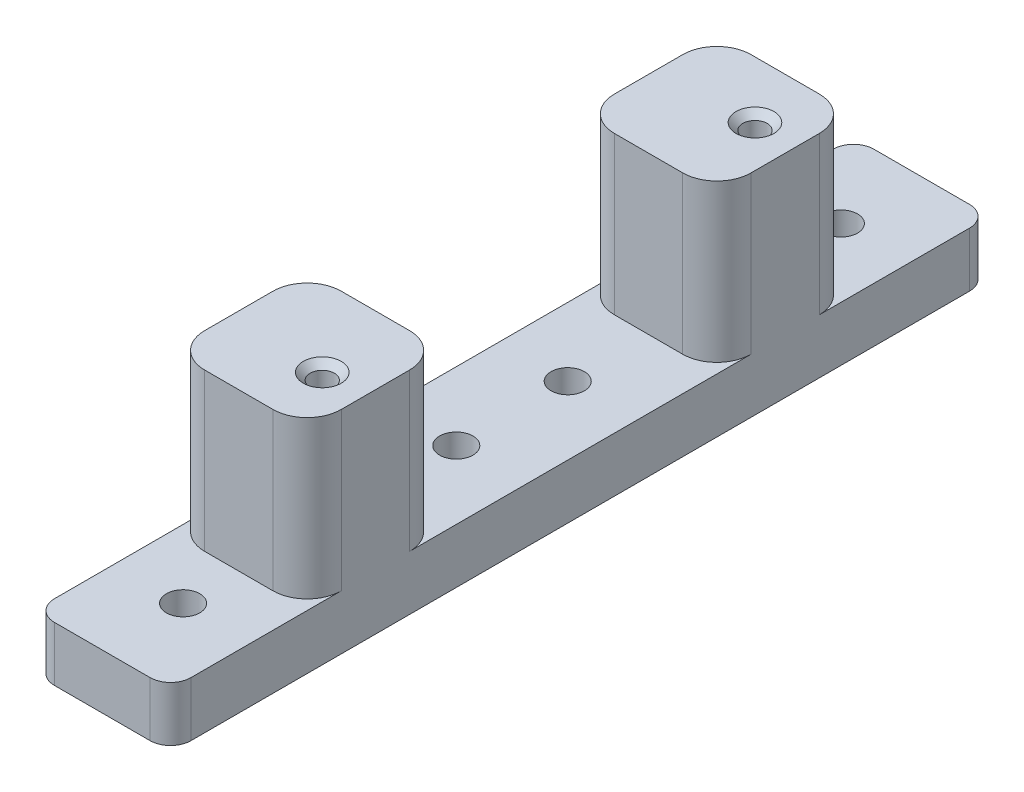
ISO-10303-21;
HEADER;
FILE_DESCRIPTION(('STEP AP214'),'2;1');
FILE_NAME('part.step','',(''),(''),'','','');
FILE_SCHEMA(('AUTOMOTIVE_DESIGN { 1 0 10303 214 1 1 1 1 }'));
ENDSEC;
DATA;
#1=APPLICATION_CONTEXT('core data for automotive mechanical design processes');
#2=APPLICATION_PROTOCOL_DEFINITION('international standard','automotive_design',2000,#1);
#3=PRODUCT_CONTEXT('',#1,'mechanical');
#4=PRODUCT('Part','Part','',(#3));
#5=PRODUCT_RELATED_PRODUCT_CATEGORY('part','',(#4));
#6=PRODUCT_DEFINITION_FORMATION('','',#4);
#7=PRODUCT_DEFINITION_CONTEXT('part definition',#1,'design');
#8=PRODUCT_DEFINITION('design','',#6,#7);
#9=PRODUCT_DEFINITION_SHAPE('','',#8);
#10=(LENGTH_UNIT() NAMED_UNIT(*) SI_UNIT(.MILLI.,.METRE.));
#11=(NAMED_UNIT(*) PLANE_ANGLE_UNIT() SI_UNIT($,.RADIAN.));
#12=(NAMED_UNIT(*) SI_UNIT($,.STERADIAN.) SOLID_ANGLE_UNIT());
#13=UNCERTAINTY_MEASURE_WITH_UNIT(LENGTH_MEASURE(1.E-05),#10,'distance_accuracy_value','');
#14=(GEOMETRIC_REPRESENTATION_CONTEXT(3) GLOBAL_UNCERTAINTY_ASSIGNED_CONTEXT((#13)) GLOBAL_UNIT_ASSIGNED_CONTEXT((#10,
#11,#12)) REPRESENTATION_CONTEXT('',''));
#15=CARTESIAN_POINT('',(0.,0.,0.));
#16=DIRECTION('',(0.,0.,1.));
#17=DIRECTION('',(1.,0.,0.));
#18=AXIS2_PLACEMENT_3D('',#15,#16,#17);
#19=CARTESIAN_POINT('',(0.,4.,0.));
#20=DIRECTION('',(0.,-1.,0.));
#21=DIRECTION('',(0.,0.,-1.));
#22=AXIS2_PLACEMENT_3D('',#19,#20,#21);
#23=PLANE('',#22);
#24=CARTESIAN_POINT('',(0.,4.,-4.08));
#25=DIRECTION('',(0.,1.,0.));
#26=DIRECTION('',(0.,0.,1.));
#27=AXIS2_PLACEMENT_3D('',#24,#25,#26);
#28=CIRCLE('',#27,1.2192);
#29=CARTESIAN_POINT('',(0.,4.,-2.8608));
#30=VERTEX_POINT('',#29);
#31=EDGE_CURVE('E278',#30,#30,#28,.T.);
#32=ORIENTED_EDGE('',*,*,#31,.F.);
#33=EDGE_LOOP('',(#32));
#34=FACE_BOUND('',#33,.T.);
#35=CARTESIAN_POINT('',(0.,4.,4.08));
#36=DIRECTION('',(0.,1.,0.));
#37=DIRECTION('',(0.,0.,1.));
#38=AXIS2_PLACEMENT_3D('',#35,#36,#37);
#39=CIRCLE('',#38,1.2192);
#40=CARTESIAN_POINT('',(0.,4.,5.2992));
#41=VERTEX_POINT('',#40);
#42=EDGE_CURVE('E262',#41,#41,#39,.T.);
#43=ORIENTED_EDGE('',*,*,#42,.F.);
#44=EDGE_LOOP('',(#43));
#45=FACE_BOUND('',#44,.T.);
#46=DIRECTION('',(0.,0.,-1.));
#47=VECTOR('',#46,1.);
#48=CARTESIAN_POINT('',(5.,4.,30.));
#49=LINE('',#48,#47);
#50=CARTESIAN_POINT('',(5.,4.,12.5));
#51=VERTEX_POINT('',#50);
#52=CARTESIAN_POINT('',(5.,4.,-12.5));
#53=VERTEX_POINT('',#52);
#54=EDGE_CURVE('E294',#51,#53,#49,.T.);
#55=ORIENTED_EDGE('',*,*,#54,.T.);
#56=CARTESIAN_POINT('',(2.5,4.,-12.5));
#57=DIRECTION('',(0.,-1.,0.));
#58=DIRECTION('',(0.,0.,-1.));
#59=AXIS2_PLACEMENT_3D('',#56,#57,#58);
#60=CIRCLE('',#59,2.5);
#61=CARTESIAN_POINT('',(2.5,4.,-10.));
#62=VERTEX_POINT('',#61);
#63=EDGE_CURVE('E428',#53,#62,#60,.T.);
#64=ORIENTED_EDGE('',*,*,#63,.T.);
#65=DIRECTION('',(-1.,0.,0.));
#66=VECTOR('',#65,1.);
#67=CARTESIAN_POINT('',(-5.,4.,-9.99999999999999));
#68=LINE('',#67,#66);
#69=CARTESIAN_POINT('',(-2.5,4.,-9.99999999999999));
#70=VERTEX_POINT('',#69);
#71=EDGE_CURVE('E226',#62,#70,#68,.T.);
#72=ORIENTED_EDGE('',*,*,#71,.T.);
#73=CARTESIAN_POINT('',(-2.5,4.,-12.5));
#74=DIRECTION('',(0.,-1.,0.));
#75=DIRECTION('',(0.,0.,-1.));
#76=AXIS2_PLACEMENT_3D('',#73,#74,#75);
#77=CIRCLE('',#76,2.5);
#78=CARTESIAN_POINT('',(-5.,4.,-12.5));
#79=VERTEX_POINT('',#78);
#80=EDGE_CURVE('E425',#70,#79,#77,.T.);
#81=ORIENTED_EDGE('',*,*,#80,.T.);
#82=DIRECTION('',(0.,0.,1.));
#83=VECTOR('',#82,1.);
#84=CARTESIAN_POINT('',(-5.,4.,30.));
#85=LINE('',#84,#83);
#86=CARTESIAN_POINT('',(-5.,4.,12.5));
#87=VERTEX_POINT('',#86);
#88=EDGE_CURVE('E302',#79,#87,#85,.T.);
#89=ORIENTED_EDGE('',*,*,#88,.T.);
#90=CARTESIAN_POINT('',(-2.5,4.,12.5));
#91=DIRECTION('',(0.,-1.,0.));
#92=DIRECTION('',(0.,0.,-1.));
#93=AXIS2_PLACEMENT_3D('',#90,#91,#92);
#94=CIRCLE('',#93,2.5);
#95=CARTESIAN_POINT('',(-2.5,4.,9.99999999999999));
#96=VERTEX_POINT('',#95);
#97=EDGE_CURVE('E382',#87,#96,#94,.T.);
#98=ORIENTED_EDGE('',*,*,#97,.T.);
#99=DIRECTION('',(-1.,0.,0.));
#100=VECTOR('',#99,1.);
#101=CARTESIAN_POINT('',(-5.,4.,9.99999999999999));
#102=LINE('',#101,#100);
#103=CARTESIAN_POINT('',(2.5,4.,10.));
#104=VERTEX_POINT('',#103);
#105=EDGE_CURVE('E253',#104,#96,#102,.T.);
#106=ORIENTED_EDGE('',*,*,#105,.F.);
#107=CARTESIAN_POINT('',(2.5,4.,12.5));
#108=DIRECTION('',(0.,-1.,0.));
#109=DIRECTION('',(0.,0.,-1.));
#110=AXIS2_PLACEMENT_3D('',#107,#108,#109);
#111=CIRCLE('',#110,2.5);
#112=EDGE_CURVE('E384',#104,#51,#111,.T.);
#113=ORIENTED_EDGE('',*,*,#112,.T.);
#114=EDGE_LOOP('',(#55,#64,#72,#81,#89,#98,#106,#113));
#115=FACE_BOUND('',#114,.T.);
#116=ADVANCED_FACE('F47',(#34,#45,#115),#23,.F.);
#117=CARTESIAN_POINT('',(0.,4.,-24.08));
#118=DIRECTION('',(0.,1.,0.));
#119=DIRECTION('',(0.,0.,1.));
#120=AXIS2_PLACEMENT_3D('',#117,#118,#119);
#121=CIRCLE('',#120,1.2192);
#122=CARTESIAN_POINT('',(0.,4.,-22.8608));
#123=VERTEX_POINT('',#122);
#124=EDGE_CURVE('E272',#123,#123,#121,.T.);
#125=ORIENTED_EDGE('',*,*,#124,.F.);
#126=EDGE_LOOP('',(#125));
#127=FACE_BOUND('',#126,.T.);
#128=CARTESIAN_POINT('',(-5.,4.,-28.5));
#129=VERTEX_POINT('',#128);
#130=CARTESIAN_POINT('',(-5.,4.,-17.5));
#131=VERTEX_POINT('',#130);
#132=EDGE_CURVE('E299',#129,#131,#85,.T.);
#133=ORIENTED_EDGE('',*,*,#132,.T.);
#134=CARTESIAN_POINT('',(-2.5,4.,-17.5));
#135=DIRECTION('',(0.,-1.,0.));
#136=DIRECTION('',(0.,0.,-1.));
#137=AXIS2_PLACEMENT_3D('',#134,#135,#136);
#138=CIRCLE('',#137,2.5);
#139=CARTESIAN_POINT('',(-2.5,4.,-20.));
#140=VERTEX_POINT('',#139);
#141=EDGE_CURVE('E71',#131,#140,#138,.T.);
#142=ORIENTED_EDGE('',*,*,#141,.T.);
#143=DIRECTION('',(1.,0.,0.));
#144=VECTOR('',#143,1.);
#145=CARTESIAN_POINT('',(-5.,4.,-20.));
#146=LINE('',#145,#144);
#147=CARTESIAN_POINT('',(2.5,4.,-20.));
#148=VERTEX_POINT('',#147);
#149=EDGE_CURVE('E229',#140,#148,#146,.T.);
#150=ORIENTED_EDGE('',*,*,#149,.T.);
#151=CARTESIAN_POINT('',(2.5,4.,-17.5));
#152=DIRECTION('',(0.,-1.,0.));
#153=DIRECTION('',(0.,0.,-1.));
#154=AXIS2_PLACEMENT_3D('',#151,#152,#153);
#155=CIRCLE('',#154,2.5);
#156=CARTESIAN_POINT('',(5.,4.,-17.5));
#157=VERTEX_POINT('',#156);
#158=EDGE_CURVE('E63',#148,#157,#155,.T.);
#159=ORIENTED_EDGE('',*,*,#158,.T.);
#160=CARTESIAN_POINT('',(5.,4.,-28.5));
#161=VERTEX_POINT('',#160);
#162=EDGE_CURVE('E295',#157,#161,#49,.T.);
#163=ORIENTED_EDGE('',*,*,#162,.T.);
#164=CARTESIAN_POINT('',(3.5,4.,-28.5));
#165=DIRECTION('',(0.,-1.,0.));
#166=DIRECTION('',(0.,0.,-1.));
#167=AXIS2_PLACEMENT_3D('',#164,#165,#166);
#168=CIRCLE('',#167,1.5);
#169=CARTESIAN_POINT('',(3.5,4.,-30.));
#170=VERTEX_POINT('',#169);
#171=EDGE_CURVE('E339',#161,#170,#168,.F.);
#172=ORIENTED_EDGE('',*,*,#171,.T.);
#173=DIRECTION('',(-1.,0.,0.));
#174=VECTOR('',#173,1.);
#175=CARTESIAN_POINT('',(-5.,4.,-30.));
#176=LINE('',#175,#174);
#177=CARTESIAN_POINT('',(-3.5,4.,-30.));
#178=VERTEX_POINT('',#177);
#179=EDGE_CURVE('E293',#170,#178,#176,.T.);
#180=ORIENTED_EDGE('',*,*,#179,.T.);
#181=CARTESIAN_POINT('',(-3.5,4.,-28.5));
#182=DIRECTION('',(0.,-1.,0.));
#183=DIRECTION('',(0.,0.,-1.));
#184=AXIS2_PLACEMENT_3D('',#181,#182,#183);
#185=CIRCLE('',#184,1.5);
#186=EDGE_CURVE('E341',#178,#129,#185,.F.);
#187=ORIENTED_EDGE('',*,*,#186,.T.);
#188=EDGE_LOOP('',(#133,#142,#150,#159,#163,#172,#180,#187));
#189=FACE_BOUND('',#188,.T.);
#190=ADVANCED_FACE('F443',(#127,#189),#23,.F.);
#191=CARTESIAN_POINT('',(0.,4.,24.08));
#192=DIRECTION('',(0.,1.,0.));
#193=DIRECTION('',(0.,0.,1.));
#194=AXIS2_PLACEMENT_3D('',#191,#192,#193);
#195=CIRCLE('',#194,1.2192);
#196=CARTESIAN_POINT('',(0.,4.,25.2992));
#197=VERTEX_POINT('',#196);
#198=EDGE_CURVE('E284',#197,#197,#195,.T.);
#199=ORIENTED_EDGE('',*,*,#198,.F.);
#200=EDGE_LOOP('',(#199));
#201=FACE_BOUND('',#200,.T.);
#202=DIRECTION('',(1.,0.,0.));
#203=VECTOR('',#202,1.);
#204=CARTESIAN_POINT('',(-5.,4.,20.));
#205=LINE('',#204,#203);
#206=CARTESIAN_POINT('',(-2.5,4.,20.));
#207=VERTEX_POINT('',#206);
#208=CARTESIAN_POINT('',(2.5,4.,20.));
#209=VERTEX_POINT('',#208);
#210=EDGE_CURVE('E248',#207,#209,#205,.T.);
#211=ORIENTED_EDGE('',*,*,#210,.F.);
#212=CARTESIAN_POINT('',(-2.5,4.,17.5));
#213=DIRECTION('',(0.,-1.,0.));
#214=DIRECTION('',(0.,0.,-1.));
#215=AXIS2_PLACEMENT_3D('',#212,#213,#214);
#216=CIRCLE('',#215,2.5);
#217=CARTESIAN_POINT('',(-5.,4.,17.5));
#218=VERTEX_POINT('',#217);
#219=EDGE_CURVE('E387',#207,#218,#216,.T.);
#220=ORIENTED_EDGE('',*,*,#219,.T.);
#221=CARTESIAN_POINT('',(-5.,4.,28.5));
#222=VERTEX_POINT('',#221);
#223=EDGE_CURVE('E298',#218,#222,#85,.T.);
#224=ORIENTED_EDGE('',*,*,#223,.T.);
#225=CARTESIAN_POINT('',(-3.5,4.,28.5));
#226=DIRECTION('',(0.,-1.,0.));
#227=DIRECTION('',(0.,0.,-1.));
#228=AXIS2_PLACEMENT_3D('',#225,#226,#227);
#229=CIRCLE('',#228,1.5);
#230=CARTESIAN_POINT('',(-3.5,4.,30.));
#231=VERTEX_POINT('',#230);
#232=EDGE_CURVE('E337',#222,#231,#229,.F.);
#233=ORIENTED_EDGE('',*,*,#232,.T.);
#234=DIRECTION('',(1.,0.,0.));
#235=VECTOR('',#234,1.);
#236=CARTESIAN_POINT('',(-5.,4.,30.));
#237=LINE('',#236,#235);
#238=CARTESIAN_POINT('',(3.5,4.,30.));
#239=VERTEX_POINT('',#238);
#240=EDGE_CURVE('E301',#231,#239,#237,.T.);
#241=ORIENTED_EDGE('',*,*,#240,.T.);
#242=CARTESIAN_POINT('',(3.5,4.,28.5));
#243=DIRECTION('',(0.,-1.,0.));
#244=DIRECTION('',(0.,0.,-1.));
#245=AXIS2_PLACEMENT_3D('',#242,#243,#244);
#246=CIRCLE('',#245,1.5);
#247=CARTESIAN_POINT('',(5.,4.,28.5));
#248=VERTEX_POINT('',#247);
#249=EDGE_CURVE('E335',#239,#248,#246,.F.);
#250=ORIENTED_EDGE('',*,*,#249,.T.);
#251=CARTESIAN_POINT('',(5.,4.,17.5));
#252=VERTEX_POINT('',#251);
#253=EDGE_CURVE('E291',#248,#252,#49,.T.);
#254=ORIENTED_EDGE('',*,*,#253,.T.);
#255=CARTESIAN_POINT('',(2.5,4.,17.5));
#256=DIRECTION('',(0.,-1.,0.));
#257=DIRECTION('',(0.,0.,-1.));
#258=AXIS2_PLACEMENT_3D('',#255,#256,#257);
#259=CIRCLE('',#258,2.5);
#260=EDGE_CURVE('E390',#252,#209,#259,.T.);
#261=ORIENTED_EDGE('',*,*,#260,.T.);
#262=EDGE_LOOP('',(#211,#220,#224,#233,#241,#250,#254,#261));
#263=FACE_BOUND('',#262,.T.);
#264=ADVANCED_FACE('F446',(#201,#263),#23,.F.);
#265=CARTESIAN_POINT('',(0.,0.,0.));
#266=DIRECTION('',(0.,-1.,0.));
#267=DIRECTION('',(0.,0.,-1.));
#268=AXIS2_PLACEMENT_3D('',#265,#266,#267);
#269=PLANE('',#268);
#270=CARTESIAN_POINT('',(0.,0.,4.08));
#271=DIRECTION('',(0.,1.,0.));
#272=DIRECTION('',(0.,0.,1.));
#273=AXIS2_PLACEMENT_3D('',#270,#271,#272);
#274=CIRCLE('',#273,1.2192);
#275=CARTESIAN_POINT('',(0.,0.,5.2992));
#276=VERTEX_POINT('',#275);
#277=EDGE_CURVE('E269',#276,#276,#274,.T.);
#278=ORIENTED_EDGE('',*,*,#277,.T.);
#279=EDGE_LOOP('',(#278));
#280=FACE_BOUND('',#279,.T.);
#281=CARTESIAN_POINT('',(0.,0.,-24.08));
#282=DIRECTION('',(0.,1.,0.));
#283=DIRECTION('',(0.,0.,1.));
#284=AXIS2_PLACEMENT_3D('',#281,#282,#283);
#285=CIRCLE('',#284,1.2192);
#286=CARTESIAN_POINT('',(0.,0.,-22.8608));
#287=VERTEX_POINT('',#286);
#288=EDGE_CURVE('E275',#287,#287,#285,.T.);
#289=ORIENTED_EDGE('',*,*,#288,.T.);
#290=EDGE_LOOP('',(#289));
#291=FACE_BOUND('',#290,.T.);
#292=CARTESIAN_POINT('',(0.,0.,-4.08));
#293=DIRECTION('',(0.,1.,0.));
#294=DIRECTION('',(0.,0.,1.));
#295=AXIS2_PLACEMENT_3D('',#292,#293,#294);
#296=CIRCLE('',#295,1.2192);
#297=CARTESIAN_POINT('',(0.,0.,-2.8608));
#298=VERTEX_POINT('',#297);
#299=EDGE_CURVE('E281',#298,#298,#296,.T.);
#300=ORIENTED_EDGE('',*,*,#299,.T.);
#301=EDGE_LOOP('',(#300));
#302=FACE_BOUND('',#301,.T.);
#303=DIRECTION('',(0.,0.,1.));
#304=VECTOR('',#303,1.);
#305=CARTESIAN_POINT('',(-5.,0.,30.));
#306=LINE('',#305,#304);
#307=CARTESIAN_POINT('',(-5.,0.,-28.5));
#308=VERTEX_POINT('',#307);
#309=CARTESIAN_POINT('',(-5.,0.,28.5));
#310=VERTEX_POINT('',#309);
#311=EDGE_CURVE('E311',#308,#310,#306,.T.);
#312=ORIENTED_EDGE('',*,*,#311,.F.);
#313=CARTESIAN_POINT('',(-3.5,0.,-28.5));
#314=DIRECTION('',(0.,-1.,0.));
#315=DIRECTION('',(0.,0.,-1.));
#316=AXIS2_PLACEMENT_3D('',#313,#314,#315);
#317=CIRCLE('',#316,1.5);
#318=CARTESIAN_POINT('',(-3.5,0.,-30.));
#319=VERTEX_POINT('',#318);
#320=EDGE_CURVE('E328',#308,#319,#317,.T.);
#321=ORIENTED_EDGE('',*,*,#320,.T.);
#322=DIRECTION('',(-1.,0.,0.));
#323=VECTOR('',#322,1.);
#324=CARTESIAN_POINT('',(-5.,0.,-30.));
#325=LINE('',#324,#323);
#326=CARTESIAN_POINT('',(3.5,0.,-30.));
#327=VERTEX_POINT('',#326);
#328=EDGE_CURVE('E308',#327,#319,#325,.T.);
#329=ORIENTED_EDGE('',*,*,#328,.F.);
#330=CARTESIAN_POINT('',(3.5,0.,-28.5));
#331=DIRECTION('',(0.,-1.,0.));
#332=DIRECTION('',(0.,0.,-1.));
#333=AXIS2_PLACEMENT_3D('',#330,#331,#332);
#334=CIRCLE('',#333,1.5);
#335=CARTESIAN_POINT('',(5.,0.,-28.5));
#336=VERTEX_POINT('',#335);
#337=EDGE_CURVE('E326',#327,#336,#334,.T.);
#338=ORIENTED_EDGE('',*,*,#337,.T.);
#339=DIRECTION('',(0.,0.,-1.));
#340=VECTOR('',#339,1.);
#341=CARTESIAN_POINT('',(5.,0.,30.));
#342=LINE('',#341,#340);
#343=CARTESIAN_POINT('',(5.,0.,28.5));
#344=VERTEX_POINT('',#343);
#345=EDGE_CURVE('E290',#344,#336,#342,.T.);
#346=ORIENTED_EDGE('',*,*,#345,.F.);
#347=CARTESIAN_POINT('',(3.5,0.,28.5));
#348=DIRECTION('',(0.,-1.,0.));
#349=DIRECTION('',(0.,0.,-1.));
#350=AXIS2_PLACEMENT_3D('',#347,#348,#349);
#351=CIRCLE('',#350,1.5);
#352=CARTESIAN_POINT('',(3.5,0.,30.));
#353=VERTEX_POINT('',#352);
#354=EDGE_CURVE('E322',#344,#353,#351,.T.);
#355=ORIENTED_EDGE('',*,*,#354,.T.);
#356=DIRECTION('',(1.,0.,0.));
#357=VECTOR('',#356,1.);
#358=CARTESIAN_POINT('',(-5.,0.,30.));
#359=LINE('',#358,#357);
#360=CARTESIAN_POINT('',(-3.5,0.,30.));
#361=VERTEX_POINT('',#360);
#362=EDGE_CURVE('E314',#361,#353,#359,.T.);
#363=ORIENTED_EDGE('',*,*,#362,.F.);
#364=CARTESIAN_POINT('',(-3.5,0.,28.5));
#365=DIRECTION('',(0.,-1.,0.));
#366=DIRECTION('',(0.,0.,-1.));
#367=AXIS2_PLACEMENT_3D('',#364,#365,#366);
#368=CIRCLE('',#367,1.5);
#369=EDGE_CURVE('E324',#361,#310,#368,.T.);
#370=ORIENTED_EDGE('',*,*,#369,.T.);
#371=EDGE_LOOP('',(#312,#321,#329,#338,#346,#355,#363,#370));
#372=FACE_BOUND('',#371,.T.);
#373=CARTESIAN_POINT('',(0.,0.,24.08));
#374=DIRECTION('',(0.,1.,0.));
#375=DIRECTION('',(0.,0.,1.));
#376=AXIS2_PLACEMENT_3D('',#373,#374,#375);
#377=CIRCLE('',#376,1.2192);
#378=CARTESIAN_POINT('',(0.,0.,25.2992));
#379=VERTEX_POINT('',#378);
#380=EDGE_CURVE('E287',#379,#379,#377,.T.);
#381=ORIENTED_EDGE('',*,*,#380,.T.);
#382=EDGE_LOOP('',(#381));
#383=FACE_BOUND('',#382,.T.);
#384=ADVANCED_FACE('F457',(#280,#291,#302,#372,#383),#269,.T.);
#385=CARTESIAN_POINT('',(5.,4.,30.));
#386=DIRECTION('',(-1.,0.,0.));
#387=DIRECTION('',(0.,0.,1.));
#388=AXIS2_PLACEMENT_3D('',#385,#386,#387);
#389=PLANE('',#388);
#390=DIRECTION('',(0.,0.,1.));
#391=VECTOR('',#390,1.);
#392=CARTESIAN_POINT('',(5.,15.5,-10.));
#393=LINE('',#392,#391);
#394=CARTESIAN_POINT('',(5.,15.5,-17.5));
#395=VERTEX_POINT('',#394);
#396=CARTESIAN_POINT('',(5.,15.5,-12.5));
#397=VERTEX_POINT('',#396);
#398=EDGE_CURVE('E238',#395,#397,#393,.T.);
#399=ORIENTED_EDGE('',*,*,#398,.T.);
#400=DIRECTION('',(0.,-1.,0.));
#401=VECTOR('',#400,1.);
#402=CARTESIAN_POINT('',(5.,4.,-12.5));
#403=LINE('',#402,#401);
#404=EDGE_CURVE('E418',#397,#53,#403,.T.);
#405=ORIENTED_EDGE('',*,*,#404,.T.);
#406=ORIENTED_EDGE('',*,*,#54,.F.);
#407=DIRECTION('',(0.,-1.,0.));
#408=VECTOR('',#407,1.);
#409=CARTESIAN_POINT('',(5.,4.,12.5));
#410=LINE('',#409,#408);
#411=CARTESIAN_POINT('',(5.,15.5,12.5));
#412=VERTEX_POINT('',#411);
#413=EDGE_CURVE('E375',#51,#412,#410,.F.);
#414=ORIENTED_EDGE('',*,*,#413,.T.);
#415=DIRECTION('',(0.,0.,-1.));
#416=VECTOR('',#415,1.);
#417=CARTESIAN_POINT('',(5.,15.5,10.));
#418=LINE('',#417,#416);
#419=CARTESIAN_POINT('',(5.,15.5,17.5));
#420=VERTEX_POINT('',#419);
#421=EDGE_CURVE('E256',#420,#412,#418,.T.);
#422=ORIENTED_EDGE('',*,*,#421,.F.);
#423=DIRECTION('',(0.,-1.,0.));
#424=VECTOR('',#423,1.);
#425=CARTESIAN_POINT('',(5.,4.,17.5));
#426=LINE('',#425,#424);
#427=EDGE_CURVE('E372',#420,#252,#426,.T.);
#428=ORIENTED_EDGE('',*,*,#427,.T.);
#429=ORIENTED_EDGE('',*,*,#253,.F.);
#430=DIRECTION('',(0.,-1.,0.));
#431=VECTOR('',#430,1.);
#432=CARTESIAN_POINT('',(5.,4.,28.5));
#433=LINE('',#432,#431);
#434=EDGE_CURVE('E343',#248,#344,#433,.T.);
#435=ORIENTED_EDGE('',*,*,#434,.T.);
#436=ORIENTED_EDGE('',*,*,#345,.T.);
#437=DIRECTION('',(0.,-1.,0.));
#438=VECTOR('',#437,1.);
#439=CARTESIAN_POINT('',(5.,4.,-28.5));
#440=LINE('',#439,#438);
#441=EDGE_CURVE('E346',#336,#161,#440,.F.);
#442=ORIENTED_EDGE('',*,*,#441,.T.);
#443=ORIENTED_EDGE('',*,*,#162,.F.);
#444=DIRECTION('',(0.,-1.,0.));
#445=VECTOR('',#444,1.);
#446=CARTESIAN_POINT('',(5.,15.5,-17.5));
#447=LINE('',#446,#445);
#448=EDGE_CURVE('E416',#157,#395,#447,.F.);
#449=ORIENTED_EDGE('',*,*,#448,.T.);
#450=EDGE_LOOP('',(#399,#405,#406,#414,#422,#428,#429,#435,#436,#442,#443,#449));
#451=FACE_BOUND('',#450,.T.);
#452=ADVANCED_FACE('F464',(#451),#389,.F.);
#453=CARTESIAN_POINT('',(-5.,4.,-30.));
#454=DIRECTION('',(0.,0.,1.));
#455=DIRECTION('',(1.,0.,0.));
#456=AXIS2_PLACEMENT_3D('',#453,#454,#455);
#457=PLANE('',#456);
#458=ORIENTED_EDGE('',*,*,#328,.T.);
#459=DIRECTION('',(0.,-1.,0.));
#460=VECTOR('',#459,1.);
#461=CARTESIAN_POINT('',(-3.5,4.,-30.));
#462=LINE('',#461,#460);
#463=EDGE_CURVE('E333',#319,#178,#462,.F.);
#464=ORIENTED_EDGE('',*,*,#463,.T.);
#465=ORIENTED_EDGE('',*,*,#179,.F.);
#466=DIRECTION('',(0.,-1.,0.));
#467=VECTOR('',#466,1.);
#468=CARTESIAN_POINT('',(3.5,4.,-30.));
#469=LINE('',#468,#467);
#470=EDGE_CURVE('E330',#170,#327,#469,.T.);
#471=ORIENTED_EDGE('',*,*,#470,.T.);
#472=EDGE_LOOP('',(#458,#464,#465,#471));
#473=FACE_BOUND('',#472,.T.);
#474=ADVANCED_FACE('F573',(#473),#457,.F.);
#475=CARTESIAN_POINT('',(-5.,4.,30.));
#476=DIRECTION('',(1.,0.,0.));
#477=DIRECTION('',(0.,0.,-1.));
#478=AXIS2_PLACEMENT_3D('',#475,#476,#477);
#479=PLANE('',#478);
#480=ORIENTED_EDGE('',*,*,#88,.F.);
#481=DIRECTION('',(0.,-1.,0.));
#482=VECTOR('',#481,1.);
#483=CARTESIAN_POINT('',(-5.,15.5,-12.5));
#484=LINE('',#483,#482);
#485=CARTESIAN_POINT('',(-5.,15.5,-12.5));
#486=VERTEX_POINT('',#485);
#487=EDGE_CURVE('E406',#79,#486,#484,.F.);
#488=ORIENTED_EDGE('',*,*,#487,.T.);
#489=DIRECTION('',(0.,0.,-1.));
#490=VECTOR('',#489,1.);
#491=CARTESIAN_POINT('',(-5.,15.5,-9.99999999999999));
#492=LINE('',#491,#490);
#493=CARTESIAN_POINT('',(-5.,15.5,-17.5));
#494=VERTEX_POINT('',#493);
#495=EDGE_CURVE('E232',#486,#494,#492,.T.);
#496=ORIENTED_EDGE('',*,*,#495,.T.);
#497=DIRECTION('',(0.,-1.,0.));
#498=VECTOR('',#497,1.);
#499=CARTESIAN_POINT('',(-5.,4.,-17.5));
#500=LINE('',#499,#498);
#501=EDGE_CURVE('E403',#494,#131,#500,.T.);
#502=ORIENTED_EDGE('',*,*,#501,.T.);
#503=ORIENTED_EDGE('',*,*,#132,.F.);
#504=DIRECTION('',(0.,-1.,0.));
#505=VECTOR('',#504,1.);
#506=CARTESIAN_POINT('',(-5.,4.,-28.5));
#507=LINE('',#506,#505);
#508=EDGE_CURVE('E319',#129,#308,#507,.T.);
#509=ORIENTED_EDGE('',*,*,#508,.T.);
#510=ORIENTED_EDGE('',*,*,#311,.T.);
#511=DIRECTION('',(0.,-1.,0.));
#512=VECTOR('',#511,1.);
#513=CARTESIAN_POINT('',(-5.,4.,28.5));
#514=LINE('',#513,#512);
#515=EDGE_CURVE('E305',#310,#222,#514,.F.);
#516=ORIENTED_EDGE('',*,*,#515,.T.);
#517=ORIENTED_EDGE('',*,*,#223,.F.);
#518=DIRECTION('',(0.,-1.,0.));
#519=VECTOR('',#518,1.);
#520=CARTESIAN_POINT('',(-5.,4.,17.5));
#521=LINE('',#520,#519);
#522=CARTESIAN_POINT('',(-5.,15.5,17.5));
#523=VERTEX_POINT('',#522);
#524=EDGE_CURVE('E354',#218,#523,#521,.F.);
#525=ORIENTED_EDGE('',*,*,#524,.T.);
#526=DIRECTION('',(0.,0.,1.));
#527=VECTOR('',#526,1.);
#528=CARTESIAN_POINT('',(-5.,15.5,9.99999999999999));
#529=LINE('',#528,#527);
#530=CARTESIAN_POINT('',(-5.,15.5,12.5));
#531=VERTEX_POINT('',#530);
#532=EDGE_CURVE('E249',#531,#523,#529,.T.);
#533=ORIENTED_EDGE('',*,*,#532,.F.);
#534=DIRECTION('',(0.,-1.,0.));
#535=VECTOR('',#534,1.);
#536=CARTESIAN_POINT('',(-5.,4.,12.5));
#537=LINE('',#536,#535);
#538=EDGE_CURVE('E356',#531,#87,#537,.T.);
#539=ORIENTED_EDGE('',*,*,#538,.T.);
#540=EDGE_LOOP('',(#480,#488,#496,#502,#503,#509,#510,#516,#517,#525,#533,#539));
#541=FACE_BOUND('',#540,.T.);
#542=ADVANCED_FACE('F503',(#541),#479,.F.);
#543=CARTESIAN_POINT('',(-5.,4.,30.));
#544=DIRECTION('',(0.,0.,-1.));
#545=DIRECTION('',(-1.,0.,0.));
#546=AXIS2_PLACEMENT_3D('',#543,#544,#545);
#547=PLANE('',#546);
#548=ORIENTED_EDGE('',*,*,#240,.F.);
#549=DIRECTION('',(0.,-1.,0.));
#550=VECTOR('',#549,1.);
#551=CARTESIAN_POINT('',(-3.5,4.,30.));
#552=LINE('',#551,#550);
#553=EDGE_CURVE('E351',#231,#361,#552,.T.);
#554=ORIENTED_EDGE('',*,*,#553,.T.);
#555=ORIENTED_EDGE('',*,*,#362,.T.);
#556=DIRECTION('',(0.,-1.,0.));
#557=VECTOR('',#556,1.);
#558=CARTESIAN_POINT('',(3.5,4.,30.));
#559=LINE('',#558,#557);
#560=EDGE_CURVE('E349',#353,#239,#559,.F.);
#561=ORIENTED_EDGE('',*,*,#560,.T.);
#562=EDGE_LOOP('',(#548,#554,#555,#561));
#563=FACE_BOUND('',#562,.T.);
#564=ADVANCED_FACE('F587',(#563),#547,.F.);
#565=CARTESIAN_POINT('',(0.,4.,24.08));
#566=DIRECTION('',(0.,1.,0.));
#567=DIRECTION('',(0.,0.,1.));
#568=AXIS2_PLACEMENT_3D('',#565,#566,#567);
#569=CYLINDRICAL_SURFACE('',#568,1.2192);
#570=ORIENTED_EDGE('',*,*,#380,.F.);
#571=EDGE_LOOP('',(#570));
#572=FACE_BOUND('',#571,.T.);
#573=ORIENTED_EDGE('',*,*,#198,.T.);
#574=EDGE_LOOP('',(#573));
#575=FACE_BOUND('',#574,.T.);
#576=ADVANCED_FACE('F628',(#572,#575),#569,.F.);
#577=CARTESIAN_POINT('',(0.,4.,-4.08));
#578=DIRECTION('',(0.,1.,0.));
#579=DIRECTION('',(0.,0.,1.));
#580=AXIS2_PLACEMENT_3D('',#577,#578,#579);
#581=CYLINDRICAL_SURFACE('',#580,1.2192);
#582=ORIENTED_EDGE('',*,*,#299,.F.);
#583=EDGE_LOOP('',(#582));
#584=FACE_BOUND('',#583,.T.);
#585=ORIENTED_EDGE('',*,*,#31,.T.);
#586=EDGE_LOOP('',(#585));
#587=FACE_BOUND('',#586,.T.);
#588=ADVANCED_FACE('F625',(#584,#587),#581,.F.);
#589=CARTESIAN_POINT('',(0.,4.,-24.08));
#590=DIRECTION('',(0.,1.,0.));
#591=DIRECTION('',(0.,0.,1.));
#592=AXIS2_PLACEMENT_3D('',#589,#590,#591);
#593=CYLINDRICAL_SURFACE('',#592,1.2192);
#594=ORIENTED_EDGE('',*,*,#288,.F.);
#595=EDGE_LOOP('',(#594));
#596=FACE_BOUND('',#595,.T.);
#597=ORIENTED_EDGE('',*,*,#124,.T.);
#598=EDGE_LOOP('',(#597));
#599=FACE_BOUND('',#598,.T.);
#600=ADVANCED_FACE('F621',(#596,#599),#593,.F.);
#601=CARTESIAN_POINT('',(0.,4.,4.08));
#602=DIRECTION('',(0.,1.,0.));
#603=DIRECTION('',(0.,0.,1.));
#604=AXIS2_PLACEMENT_3D('',#601,#602,#603);
#605=CYLINDRICAL_SURFACE('',#604,1.2192);
#606=ORIENTED_EDGE('',*,*,#277,.F.);
#607=EDGE_LOOP('',(#606));
#608=FACE_BOUND('',#607,.T.);
#609=ORIENTED_EDGE('',*,*,#42,.T.);
#610=EDGE_LOOP('',(#609));
#611=FACE_BOUND('',#610,.T.);
#612=ADVANCED_FACE('F618',(#608,#611),#605,.F.);
#613=CARTESIAN_POINT('',(-3.5,4.,-28.5));
#614=DIRECTION('',(0.,-1.,0.));
#615=DIRECTION('',(0.,0.,-1.));
#616=AXIS2_PLACEMENT_3D('',#613,#614,#615);
#617=CYLINDRICAL_SURFACE('',#616,1.5);
#618=ORIENTED_EDGE('',*,*,#186,.F.);
#619=ORIENTED_EDGE('',*,*,#463,.F.);
#620=ORIENTED_EDGE('',*,*,#320,.F.);
#621=ORIENTED_EDGE('',*,*,#508,.F.);
#622=EDGE_LOOP('',(#618,#619,#620,#621));
#623=FACE_BOUND('',#622,.T.);
#624=ADVANCED_FACE('F567',(#623),#617,.T.);
#625=CARTESIAN_POINT('',(3.5,4.,-28.5));
#626=DIRECTION('',(0.,-1.,0.));
#627=DIRECTION('',(0.,0.,-1.));
#628=AXIS2_PLACEMENT_3D('',#625,#626,#627);
#629=CYLINDRICAL_SURFACE('',#628,1.5);
#630=ORIENTED_EDGE('',*,*,#171,.F.);
#631=ORIENTED_EDGE('',*,*,#441,.F.);
#632=ORIENTED_EDGE('',*,*,#337,.F.);
#633=ORIENTED_EDGE('',*,*,#470,.F.);
#634=EDGE_LOOP('',(#630,#631,#632,#633));
#635=FACE_BOUND('',#634,.T.);
#636=ADVANCED_FACE('F577',(#635),#629,.T.);
#637=CARTESIAN_POINT('',(-3.5,4.,28.5));
#638=DIRECTION('',(0.,-1.,0.));
#639=DIRECTION('',(0.,0.,-1.));
#640=AXIS2_PLACEMENT_3D('',#637,#638,#639);
#641=CYLINDRICAL_SURFACE('',#640,1.5);
#642=ORIENTED_EDGE('',*,*,#232,.F.);
#643=ORIENTED_EDGE('',*,*,#515,.F.);
#644=ORIENTED_EDGE('',*,*,#369,.F.);
#645=ORIENTED_EDGE('',*,*,#553,.F.);
#646=EDGE_LOOP('',(#642,#643,#644,#645));
#647=FACE_BOUND('',#646,.T.);
#648=ADVANCED_FACE('F591',(#647),#641,.T.);
#649=CARTESIAN_POINT('',(3.5,4.,28.5));
#650=DIRECTION('',(0.,-1.,0.));
#651=DIRECTION('',(0.,0.,-1.));
#652=AXIS2_PLACEMENT_3D('',#649,#650,#651);
#653=CYLINDRICAL_SURFACE('',#652,1.5);
#654=ORIENTED_EDGE('',*,*,#249,.F.);
#655=ORIENTED_EDGE('',*,*,#560,.F.);
#656=ORIENTED_EDGE('',*,*,#354,.F.);
#657=ORIENTED_EDGE('',*,*,#434,.F.);
#658=EDGE_LOOP('',(#654,#655,#656,#657));
#659=FACE_BOUND('',#658,.T.);
#660=ADVANCED_FACE('F582',(#659),#653,.T.);
#661=CARTESIAN_POINT('',(-5.,15.5,20.));
#662=DIRECTION('',(0.,0.,-1.));
#663=DIRECTION('',(-1.,0.,0.));
#664=AXIS2_PLACEMENT_3D('',#661,#662,#663);
#665=PLANE('',#664);
#666=DIRECTION('',(1.,0.,0.));
#667=VECTOR('',#666,1.);
#668=CARTESIAN_POINT('',(-5.,15.5,20.));
#669=LINE('',#668,#667);
#670=CARTESIAN_POINT('',(-2.5,15.5,20.));
#671=VERTEX_POINT('',#670);
#672=CARTESIAN_POINT('',(2.5,15.5,20.));
#673=VERTEX_POINT('',#672);
#674=EDGE_CURVE('E252',#671,#673,#669,.T.);
#675=ORIENTED_EDGE('',*,*,#674,.F.);
#676=DIRECTION('',(0.,-1.,0.));
#677=VECTOR('',#676,1.);
#678=CARTESIAN_POINT('',(-2.5,15.5,20.));
#679=LINE('',#678,#677);
#680=EDGE_CURVE('E379',#671,#207,#679,.T.);
#681=ORIENTED_EDGE('',*,*,#680,.T.);
#682=ORIENTED_EDGE('',*,*,#210,.T.);
#683=DIRECTION('',(0.,-1.,0.));
#684=VECTOR('',#683,1.);
#685=CARTESIAN_POINT('',(2.5,15.5,20.));
#686=LINE('',#685,#684);
#687=EDGE_CURVE('E377',#209,#673,#686,.F.);
#688=ORIENTED_EDGE('',*,*,#687,.T.);
#689=EDGE_LOOP('',(#675,#681,#682,#688));
#690=FACE_BOUND('',#689,.T.);
#691=ADVANCED_FACE('F474',(#690),#665,.F.);
#692=CARTESIAN_POINT('',(-5.,15.5,9.99999999999999));
#693=DIRECTION('',(0.,0.,1.));
#694=DIRECTION('',(1.,0.,0.));
#695=AXIS2_PLACEMENT_3D('',#692,#693,#694);
#696=PLANE('',#695);
#697=ORIENTED_EDGE('',*,*,#105,.T.);
#698=DIRECTION('',(0.,-1.,0.));
#699=VECTOR('',#698,1.);
#700=CARTESIAN_POINT('',(-2.5,15.5,9.99999999999999));
#701=LINE('',#700,#699);
#702=CARTESIAN_POINT('',(-2.5,15.5,9.99999999999999));
#703=VERTEX_POINT('',#702);
#704=EDGE_CURVE('E362',#96,#703,#701,.F.);
#705=ORIENTED_EDGE('',*,*,#704,.T.);
#706=DIRECTION('',(-1.,0.,0.));
#707=VECTOR('',#706,1.);
#708=CARTESIAN_POINT('',(-5.,15.5,9.99999999999999));
#709=LINE('',#708,#707);
#710=CARTESIAN_POINT('',(2.5,15.5,10.));
#711=VERTEX_POINT('',#710);
#712=EDGE_CURVE('E259',#711,#703,#709,.T.);
#713=ORIENTED_EDGE('',*,*,#712,.F.);
#714=DIRECTION('',(0.,-1.,0.));
#715=VECTOR('',#714,1.);
#716=CARTESIAN_POINT('',(2.5,15.5,10.));
#717=LINE('',#716,#715);
#718=EDGE_CURVE('E359',#711,#104,#717,.T.);
#719=ORIENTED_EDGE('',*,*,#718,.T.);
#720=EDGE_LOOP('',(#697,#705,#713,#719));
#721=FACE_BOUND('',#720,.T.);
#722=ADVANCED_FACE('F493',(#721),#696,.F.);
#723=CARTESIAN_POINT('',(0.,15.5,0.));
#724=DIRECTION('',(0.,1.,0.));
#725=DIRECTION('',(0.,0.,1.));
#726=AXIS2_PLACEMENT_3D('',#723,#724,#725);
#727=PLANE('',#726);
#728=CARTESIAN_POINT('',(1.95,15.5,15.84));
#729=DIRECTION('',(0.,1.,0.));
#730=DIRECTION('',(0.,0.,1.));
#731=AXIS2_PLACEMENT_3D('',#728,#729,#730);
#732=CIRCLE('',#731,1.38899999999999);
#733=CARTESIAN_POINT('',(1.95,15.5,17.229));
#734=VERTEX_POINT('',#733);
#735=EDGE_CURVE('E395',#734,#734,#732,.F.);
#736=ORIENTED_EDGE('',*,*,#735,.T.);
#737=EDGE_LOOP('',(#736));
#738=FACE_BOUND('',#737,.T.);
#739=ORIENTED_EDGE('',*,*,#712,.T.);
#740=CARTESIAN_POINT('',(-2.5,15.5,12.5));
#741=DIRECTION('',(0.,1.,0.));
#742=DIRECTION('',(0.,0.,1.));
#743=AXIS2_PLACEMENT_3D('',#740,#741,#742);
#744=CIRCLE('',#743,2.5);
#745=EDGE_CURVE('E370',#703,#531,#744,.T.);
#746=ORIENTED_EDGE('',*,*,#745,.T.);
#747=ORIENTED_EDGE('',*,*,#532,.T.);
#748=CARTESIAN_POINT('',(-2.5,15.5,17.5));
#749=DIRECTION('',(0.,1.,0.));
#750=DIRECTION('',(0.,0.,1.));
#751=AXIS2_PLACEMENT_3D('',#748,#749,#750);
#752=CIRCLE('',#751,2.5);
#753=EDGE_CURVE('E366',#523,#671,#752,.T.);
#754=ORIENTED_EDGE('',*,*,#753,.T.);
#755=ORIENTED_EDGE('',*,*,#674,.T.);
#756=CARTESIAN_POINT('',(2.5,15.5,17.5));
#757=DIRECTION('',(0.,1.,0.));
#758=DIRECTION('',(0.,0.,1.));
#759=AXIS2_PLACEMENT_3D('',#756,#757,#758);
#760=CIRCLE('',#759,2.5);
#761=EDGE_CURVE('E364',#673,#420,#760,.T.);
#762=ORIENTED_EDGE('',*,*,#761,.T.);
#763=ORIENTED_EDGE('',*,*,#421,.T.);
#764=CARTESIAN_POINT('',(2.5,15.5,12.5));
#765=DIRECTION('',(0.,1.,0.));
#766=DIRECTION('',(0.,0.,1.));
#767=AXIS2_PLACEMENT_3D('',#764,#765,#766);
#768=CIRCLE('',#767,2.5);
#769=EDGE_CURVE('E368',#412,#711,#768,.T.);
#770=ORIENTED_EDGE('',*,*,#769,.T.);
#771=EDGE_LOOP('',(#739,#746,#747,#754,#755,#762,#763,#770));
#772=FACE_BOUND('',#771,.T.);
#773=ADVANCED_FACE('F482',(#738,#772),#727,.T.);
#774=CARTESIAN_POINT('',(-2.5,4.,12.5));
#775=DIRECTION('',(0.,-1.,0.));
#776=DIRECTION('',(0.,0.,-1.));
#777=AXIS2_PLACEMENT_3D('',#774,#775,#776);
#778=CYLINDRICAL_SURFACE('',#777,2.5);
#779=ORIENTED_EDGE('',*,*,#745,.F.);
#780=ORIENTED_EDGE('',*,*,#704,.F.);
#781=ORIENTED_EDGE('',*,*,#97,.F.);
#782=ORIENTED_EDGE('',*,*,#538,.F.);
#783=EDGE_LOOP('',(#779,#780,#781,#782));
#784=FACE_BOUND('',#783,.T.);
#785=ADVANCED_FACE('F498',(#784),#778,.T.);
#786=CARTESIAN_POINT('',(2.5,15.5,12.5));
#787=DIRECTION('',(0.,-1.,0.));
#788=DIRECTION('',(0.,0.,-1.));
#789=AXIS2_PLACEMENT_3D('',#786,#787,#788);
#790=CYLINDRICAL_SURFACE('',#789,2.5);
#791=ORIENTED_EDGE('',*,*,#769,.F.);
#792=ORIENTED_EDGE('',*,*,#413,.F.);
#793=ORIENTED_EDGE('',*,*,#112,.F.);
#794=ORIENTED_EDGE('',*,*,#718,.F.);
#795=EDGE_LOOP('',(#791,#792,#793,#794));
#796=FACE_BOUND('',#795,.T.);
#797=ADVANCED_FACE('F488',(#796),#790,.T.);
#798=CARTESIAN_POINT('',(-2.5,15.5,17.5));
#799=DIRECTION('',(0.,-1.,0.));
#800=DIRECTION('',(0.,0.,-1.));
#801=AXIS2_PLACEMENT_3D('',#798,#799,#800);
#802=CYLINDRICAL_SURFACE('',#801,2.5);
#803=ORIENTED_EDGE('',*,*,#753,.F.);
#804=ORIENTED_EDGE('',*,*,#524,.F.);
#805=ORIENTED_EDGE('',*,*,#219,.F.);
#806=ORIENTED_EDGE('',*,*,#680,.F.);
#807=EDGE_LOOP('',(#803,#804,#805,#806));
#808=FACE_BOUND('',#807,.T.);
#809=ADVANCED_FACE('F505',(#808),#802,.T.);
#810=CARTESIAN_POINT('',(2.5,4.,17.5));
#811=DIRECTION('',(0.,-1.,0.));
#812=DIRECTION('',(0.,0.,-1.));
#813=AXIS2_PLACEMENT_3D('',#810,#811,#812);
#814=CYLINDRICAL_SURFACE('',#813,2.5);
#815=ORIENTED_EDGE('',*,*,#761,.F.);
#816=ORIENTED_EDGE('',*,*,#687,.F.);
#817=ORIENTED_EDGE('',*,*,#260,.F.);
#818=ORIENTED_EDGE('',*,*,#427,.F.);
#819=EDGE_LOOP('',(#815,#816,#817,#818));
#820=FACE_BOUND('',#819,.T.);
#821=ADVANCED_FACE('F478',(#820),#814,.T.);
#822=CARTESIAN_POINT('',(1.95,5.34,15.84));
#823=DIRECTION('',(0.,1.,0.));
#824=DIRECTION('',(0.,0.,1.));
#825=AXIS2_PLACEMENT_3D('',#822,#823,#824);
#826=CONICAL_SURFACE('',#825,0.888999999999998,1.02974425867665);
#827=CARTESIAN_POINT('',(1.95,4.8058349096845,15.84));
#828=VERTEX_POINT('',#827);
#829=VERTEX_LOOP('',#828);
#830=FACE_BOUND('',#829,.T.);
#831=CARTESIAN_POINT('',(1.95,5.34,15.84));
#832=DIRECTION('',(0.,1.,0.));
#833=DIRECTION('',(0.,0.,1.));
#834=AXIS2_PLACEMENT_3D('',#831,#832,#833);
#835=CIRCLE('',#834,0.888999999999998);
#836=CARTESIAN_POINT('',(1.95,5.34,16.729));
#837=VERTEX_POINT('',#836);
#838=EDGE_CURVE('E243',#837,#837,#835,.T.);
#839=ORIENTED_EDGE('',*,*,#838,.T.);
#840=EDGE_LOOP('',(#839));
#841=FACE_BOUND('',#840,.T.);
#842=ADVANCED_FACE('F512',(#830,#841),#826,.F.);
#843=CARTESIAN_POINT('',(1.95,15.5,15.84));
#844=DIRECTION('',(0.,1.,0.));
#845=DIRECTION('',(0.,0.,1.));
#846=AXIS2_PLACEMENT_3D('',#843,#844,#845);
#847=CYLINDRICAL_SURFACE('',#846,0.888999999999998);
#848=CARTESIAN_POINT('',(1.95,15.,15.84));
#849=DIRECTION('',(0.,1.,0.));
#850=DIRECTION('',(0.,0.,1.));
#851=AXIS2_PLACEMENT_3D('',#848,#849,#850);
#852=CIRCLE('',#851,0.888999999999998);
#853=CARTESIAN_POINT('',(1.95,15.,16.729));
#854=VERTEX_POINT('',#853);
#855=EDGE_CURVE('E392',#854,#854,#852,.T.);
#856=ORIENTED_EDGE('',*,*,#855,.T.);
#857=EDGE_LOOP('',(#856));
#858=FACE_BOUND('',#857,.T.);
#859=ORIENTED_EDGE('',*,*,#838,.F.);
#860=EDGE_LOOP('',(#859));
#861=FACE_BOUND('',#860,.T.);
#862=ADVANCED_FACE('F523',(#858,#861),#847,.F.);
#863=CARTESIAN_POINT('',(1.95,15.,15.84));
#864=DIRECTION('',(0.,1.,0.));
#865=DIRECTION('',(0.,0.,1.));
#866=AXIS2_PLACEMENT_3D('',#863,#864,#865);
#867=CONICAL_SURFACE('',#866,0.888999999999998,0.785398163397446);
#868=ORIENTED_EDGE('',*,*,#735,.F.);
#869=EDGE_LOOP('',(#868));
#870=FACE_BOUND('',#869,.T.);
#871=ORIENTED_EDGE('',*,*,#855,.F.);
#872=EDGE_LOOP('',(#871));
#873=FACE_BOUND('',#872,.T.);
#874=ADVANCED_FACE('F518',(#870,#873),#867,.F.);
#875=CARTESIAN_POINT('',(-5.,15.5,-9.99999999999999));
#876=DIRECTION('',(0.,0.,1.));
#877=DIRECTION('',(1.,0.,0.));
#878=AXIS2_PLACEMENT_3D('',#875,#876,#877);
#879=PLANE('',#878);
#880=DIRECTION('',(-1.,0.,0.));
#881=VECTOR('',#880,1.);
#882=CARTESIAN_POINT('',(-5.,15.5,-9.99999999999999));
#883=LINE('',#882,#881);
#884=CARTESIAN_POINT('',(2.5,15.5,-10.));
#885=VERTEX_POINT('',#884);
#886=CARTESIAN_POINT('',(-2.5,15.5,-9.99999999999999));
#887=VERTEX_POINT('',#886);
#888=EDGE_CURVE('E235',#885,#887,#883,.T.);
#889=ORIENTED_EDGE('',*,*,#888,.T.);
#890=DIRECTION('',(0.,-1.,0.));
#891=VECTOR('',#890,1.);
#892=CARTESIAN_POINT('',(-2.5,4.,-9.99999999999999));
#893=LINE('',#892,#891);
#894=EDGE_CURVE('E400',#887,#70,#893,.T.);
#895=ORIENTED_EDGE('',*,*,#894,.T.);
#896=ORIENTED_EDGE('',*,*,#71,.F.);
#897=DIRECTION('',(0.,-1.,0.));
#898=VECTOR('',#897,1.);
#899=CARTESIAN_POINT('',(2.5,15.5,-10.));
#900=LINE('',#899,#898);
#901=EDGE_CURVE('E398',#62,#885,#900,.F.);
#902=ORIENTED_EDGE('',*,*,#901,.T.);
#903=EDGE_LOOP('',(#889,#895,#896,#902));
#904=FACE_BOUND('',#903,.T.);
#905=ADVANCED_FACE('F522',(#904),#879,.T.);
#906=CARTESIAN_POINT('',(-5.,15.5,-20.));
#907=DIRECTION('',(0.,0.,-1.));
#908=DIRECTION('',(-1.,0.,0.));
#909=AXIS2_PLACEMENT_3D('',#906,#907,#908);
#910=PLANE('',#909);
#911=ORIENTED_EDGE('',*,*,#149,.F.);
#912=DIRECTION('',(0.,-1.,0.));
#913=VECTOR('',#912,1.);
#914=CARTESIAN_POINT('',(-2.5,15.5,-20.));
#915=LINE('',#914,#913);
#916=CARTESIAN_POINT('',(-2.5,15.5,-20.));
#917=VERTEX_POINT('',#916);
#918=EDGE_CURVE('E423',#140,#917,#915,.F.);
#919=ORIENTED_EDGE('',*,*,#918,.T.);
#920=DIRECTION('',(1.,0.,0.));
#921=VECTOR('',#920,1.);
#922=CARTESIAN_POINT('',(-5.,15.5,-20.));
#923=LINE('',#922,#921);
#924=CARTESIAN_POINT('',(2.5,15.5,-20.));
#925=VERTEX_POINT('',#924);
#926=EDGE_CURVE('E241',#917,#925,#923,.T.);
#927=ORIENTED_EDGE('',*,*,#926,.T.);
#928=DIRECTION('',(0.,-1.,0.));
#929=VECTOR('',#928,1.);
#930=CARTESIAN_POINT('',(2.5,4.,-20.));
#931=LINE('',#930,#929);
#932=EDGE_CURVE('E421',#925,#148,#931,.T.);
#933=ORIENTED_EDGE('',*,*,#932,.T.);
#934=EDGE_LOOP('',(#911,#919,#927,#933));
#935=FACE_BOUND('',#934,.T.);
#936=ADVANCED_FACE('F547',(#935),#910,.T.);
#937=CARTESIAN_POINT('',(0.,15.5,0.));
#938=DIRECTION('',(0.,1.,0.));
#939=DIRECTION('',(0.,0.,-1.));
#940=AXIS2_PLACEMENT_3D('',#937,#938,#939);
#941=PLANE('',#940);
#942=CARTESIAN_POINT('',(1.95,15.5,-15.84));
#943=DIRECTION('',(0.,1.,0.));
#944=DIRECTION('',(0.,0.,1.));
#945=AXIS2_PLACEMENT_3D('',#942,#943,#944);
#946=CIRCLE('',#945,1.38899999999999);
#947=CARTESIAN_POINT('',(1.95,15.5,-14.451));
#948=VERTEX_POINT('',#947);
#949=EDGE_CURVE('E11',#948,#948,#946,.F.);
#950=ORIENTED_EDGE('',*,*,#949,.T.);
#951=EDGE_LOOP('',(#950));
#952=FACE_BOUND('',#951,.T.);
#953=ORIENTED_EDGE('',*,*,#495,.F.);
#954=CARTESIAN_POINT('',(-2.5,15.5,-12.5));
#955=DIRECTION('',(0.,1.,0.));
#956=DIRECTION('',(0.,0.,1.));
#957=AXIS2_PLACEMENT_3D('',#954,#955,#956);
#958=CIRCLE('',#957,2.5);
#959=EDGE_CURVE('E414',#486,#887,#958,.T.);
#960=ORIENTED_EDGE('',*,*,#959,.T.);
#961=ORIENTED_EDGE('',*,*,#888,.F.);
#962=CARTESIAN_POINT('',(2.5,15.5,-12.5));
#963=DIRECTION('',(0.,1.,0.));
#964=DIRECTION('',(0.,0.,1.));
#965=AXIS2_PLACEMENT_3D('',#962,#963,#964);
#966=CIRCLE('',#965,2.5);
#967=EDGE_CURVE('E412',#885,#397,#966,.T.);
#968=ORIENTED_EDGE('',*,*,#967,.T.);
#969=ORIENTED_EDGE('',*,*,#398,.F.);
#970=CARTESIAN_POINT('',(2.5,15.5,-17.5));
#971=DIRECTION('',(0.,1.,0.));
#972=DIRECTION('',(0.,0.,1.));
#973=AXIS2_PLACEMENT_3D('',#970,#971,#972);
#974=CIRCLE('',#973,2.5);
#975=EDGE_CURVE('E408',#395,#925,#974,.T.);
#976=ORIENTED_EDGE('',*,*,#975,.T.);
#977=ORIENTED_EDGE('',*,*,#926,.F.);
#978=CARTESIAN_POINT('',(-2.5,15.5,-17.5));
#979=DIRECTION('',(0.,1.,0.));
#980=DIRECTION('',(0.,0.,1.));
#981=AXIS2_PLACEMENT_3D('',#978,#979,#980);
#982=CIRCLE('',#981,2.5);
#983=EDGE_CURVE('E410',#917,#494,#982,.T.);
#984=ORIENTED_EDGE('',*,*,#983,.T.);
#985=EDGE_LOOP('',(#953,#960,#961,#968,#969,#976,#977,#984));
#986=FACE_BOUND('',#985,.T.);
#987=ADVANCED_FACE('F529',(#952,#986),#941,.T.);
#988=CARTESIAN_POINT('',(-2.5,15.5,-12.5));
#989=DIRECTION('',(0.,1.,0.));
#990=DIRECTION('',(0.,0.,1.));
#991=AXIS2_PLACEMENT_3D('',#988,#989,#990);
#992=CYLINDRICAL_SURFACE('',#991,2.5);
#993=ORIENTED_EDGE('',*,*,#959,.F.);
#994=ORIENTED_EDGE('',*,*,#487,.F.);
#995=ORIENTED_EDGE('',*,*,#80,.F.);
#996=ORIENTED_EDGE('',*,*,#894,.F.);
#997=EDGE_LOOP('',(#993,#994,#995,#996));
#998=FACE_BOUND('',#997,.T.);
#999=ADVANCED_FACE('F525',(#998),#992,.T.);
#1000=CARTESIAN_POINT('',(2.5,4.,-12.5));
#1001=DIRECTION('',(0.,1.,0.));
#1002=DIRECTION('',(0.,0.,1.));
#1003=AXIS2_PLACEMENT_3D('',#1000,#1001,#1002);
#1004=CYLINDRICAL_SURFACE('',#1003,2.5);
#1005=ORIENTED_EDGE('',*,*,#967,.F.);
#1006=ORIENTED_EDGE('',*,*,#901,.F.);
#1007=ORIENTED_EDGE('',*,*,#63,.F.);
#1008=ORIENTED_EDGE('',*,*,#404,.F.);
#1009=EDGE_LOOP('',(#1005,#1006,#1007,#1008));
#1010=FACE_BOUND('',#1009,.T.);
#1011=ADVANCED_FACE('F528',(#1010),#1004,.T.);
#1012=CARTESIAN_POINT('',(-2.5,4.,-17.5));
#1013=DIRECTION('',(0.,1.,0.));
#1014=DIRECTION('',(0.,0.,1.));
#1015=AXIS2_PLACEMENT_3D('',#1012,#1013,#1014);
#1016=CYLINDRICAL_SURFACE('',#1015,2.5);
#1017=ORIENTED_EDGE('',*,*,#983,.F.);
#1018=ORIENTED_EDGE('',*,*,#918,.F.);
#1019=ORIENTED_EDGE('',*,*,#141,.F.);
#1020=ORIENTED_EDGE('',*,*,#501,.F.);
#1021=EDGE_LOOP('',(#1017,#1018,#1019,#1020));
#1022=FACE_BOUND('',#1021,.T.);
#1023=ADVANCED_FACE('F533',(#1022),#1016,.T.);
#1024=CARTESIAN_POINT('',(2.5,15.5,-17.5));
#1025=DIRECTION('',(0.,1.,0.));
#1026=DIRECTION('',(0.,0.,1.));
#1027=AXIS2_PLACEMENT_3D('',#1024,#1025,#1026);
#1028=CYLINDRICAL_SURFACE('',#1027,2.5);
#1029=ORIENTED_EDGE('',*,*,#975,.F.);
#1030=ORIENTED_EDGE('',*,*,#448,.F.);
#1031=ORIENTED_EDGE('',*,*,#158,.F.);
#1032=ORIENTED_EDGE('',*,*,#932,.F.);
#1033=EDGE_LOOP('',(#1029,#1030,#1031,#1032));
#1034=FACE_BOUND('',#1033,.T.);
#1035=ADVANCED_FACE('F220',(#1034),#1028,.T.);
#1036=CARTESIAN_POINT('',(1.95,5.34,-15.84));
#1037=DIRECTION('',(0.,1.,0.));
#1038=DIRECTION('',(0.,0.,1.));
#1039=AXIS2_PLACEMENT_3D('',#1036,#1037,#1038);
#1040=CONICAL_SURFACE('',#1039,0.888999999999998,1.02974425867665);
#1041=CARTESIAN_POINT('',(1.95,4.8058349096845,-15.84));
#1042=VERTEX_POINT('',#1041);
#1043=VERTEX_LOOP('',#1042);
#1044=FACE_BOUND('',#1043,.T.);
#1045=CARTESIAN_POINT('',(1.95,5.34,-15.84));
#1046=DIRECTION('',(0.,1.,0.));
#1047=DIRECTION('',(0.,0.,1.));
#1048=AXIS2_PLACEMENT_3D('',#1045,#1046,#1047);
#1049=CIRCLE('',#1048,0.888999999999998);
#1050=CARTESIAN_POINT('',(1.95,5.34,-14.951));
#1051=VERTEX_POINT('',#1050);
#1052=EDGE_CURVE('E224',#1051,#1051,#1049,.T.);
#1053=ORIENTED_EDGE('',*,*,#1052,.T.);
#1054=EDGE_LOOP('',(#1053));
#1055=FACE_BOUND('',#1054,.T.);
#1056=ADVANCED_FACE('F216',(#1044,#1055),#1040,.F.);
#1057=CARTESIAN_POINT('',(1.95,15.5,-15.84));
#1058=DIRECTION('',(0.,1.,0.));
#1059=DIRECTION('',(0.,0.,1.));
#1060=AXIS2_PLACEMENT_3D('',#1057,#1058,#1059);
#1061=CYLINDRICAL_SURFACE('',#1060,0.888999999999998);
#1062=CARTESIAN_POINT('',(1.95,15.,-15.84));
#1063=DIRECTION('',(0.,1.,0.));
#1064=DIRECTION('',(0.,0.,1.));
#1065=AXIS2_PLACEMENT_3D('',#1062,#1063,#1064);
#1066=CIRCLE('',#1065,0.888999999999998);
#1067=CARTESIAN_POINT('',(1.95,15.,-14.951));
#1068=VERTEX_POINT('',#1067);
#1069=EDGE_CURVE('E56',#1068,#1068,#1066,.T.);
#1070=ORIENTED_EDGE('',*,*,#1069,.T.);
#1071=EDGE_LOOP('',(#1070));
#1072=FACE_BOUND('',#1071,.T.);
#1073=ORIENTED_EDGE('',*,*,#1052,.F.);
#1074=EDGE_LOOP('',(#1073));
#1075=FACE_BOUND('',#1074,.T.);
#1076=ADVANCED_FACE('F219',(#1072,#1075),#1061,.F.);
#1077=CARTESIAN_POINT('',(1.95,15.,-15.84));
#1078=DIRECTION('',(0.,1.,0.));
#1079=DIRECTION('',(0.,0.,1.));
#1080=AXIS2_PLACEMENT_3D('',#1077,#1078,#1079);
#1081=CONICAL_SURFACE('',#1080,0.888999999999998,0.785398163397444);
#1082=ORIENTED_EDGE('',*,*,#949,.F.);
#1083=EDGE_LOOP('',(#1082));
#1084=FACE_BOUND('',#1083,.T.);
#1085=ORIENTED_EDGE('',*,*,#1069,.F.);
#1086=EDGE_LOOP('',(#1085));
#1087=FACE_BOUND('',#1086,.T.);
#1088=ADVANCED_FACE('F50',(#1084,#1087),#1081,.F.);
#1089=CLOSED_SHELL('',(#116,#190,#264,#384,#452,#474,#542,#564,#576,#588,#600,#612,#624,#636,
#648,#660,#691,#722,#773,#785,#797,#809,#821,#842,#862,#874,#905,#936,#987,#999,#1011,#1023,
#1035,#1056,#1076,#1088));
#1090=MANIFOLD_SOLID_BREP('B2',#1089);
#1091=ADVANCED_BREP_SHAPE_REPRESENTATION('',(#18,#1090),#14);
#1092=SHAPE_DEFINITION_REPRESENTATION(#9,#1091);
ENDSEC;
END-ISO-10303-21;
